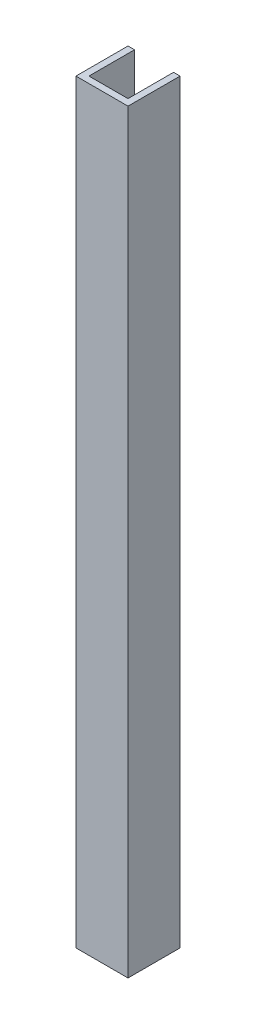
ISO-10303-21;
HEADER;
FILE_DESCRIPTION(('STEP AP214'),'2;1');
FILE_NAME('part.step','',(''),(''),'','','');
FILE_SCHEMA(('AUTOMOTIVE_DESIGN { 1 0 10303 214 1 1 1 1 }'));
ENDSEC;
DATA;
#1=APPLICATION_CONTEXT('core data for automotive mechanical design processes');
#2=APPLICATION_PROTOCOL_DEFINITION('international standard','automotive_design',2000,#1);
#3=PRODUCT_CONTEXT('',#1,'mechanical');
#4=PRODUCT('Part','Part','',(#3));
#5=PRODUCT_RELATED_PRODUCT_CATEGORY('part','',(#4));
#6=PRODUCT_DEFINITION_FORMATION('','',#4);
#7=PRODUCT_DEFINITION_CONTEXT('part definition',#1,'design');
#8=PRODUCT_DEFINITION('design','',#6,#7);
#9=PRODUCT_DEFINITION_SHAPE('','',#8);
#10=(LENGTH_UNIT() NAMED_UNIT(*) SI_UNIT(.MILLI.,.METRE.));
#11=(NAMED_UNIT(*) PLANE_ANGLE_UNIT() SI_UNIT($,.RADIAN.));
#12=(NAMED_UNIT(*) SI_UNIT($,.STERADIAN.) SOLID_ANGLE_UNIT());
#13=UNCERTAINTY_MEASURE_WITH_UNIT(LENGTH_MEASURE(1.E-05),#10,'distance_accuracy_value','');
#14=(GEOMETRIC_REPRESENTATION_CONTEXT(3) GLOBAL_UNCERTAINTY_ASSIGNED_CONTEXT((#13)) GLOBAL_UNIT_ASSIGNED_CONTEXT((#10,
#11,#12)) REPRESENTATION_CONTEXT('',''));
#15=CARTESIAN_POINT('',(0.,0.,0.));
#16=DIRECTION('',(0.,0.,1.));
#17=DIRECTION('',(1.,0.,0.));
#18=AXIS2_PLACEMENT_3D('',#15,#16,#17);
#19=CARTESIAN_POINT('',(25.4,368.3,0.));
#20=DIRECTION('',(-1.,0.,0.));
#21=DIRECTION('',(0.,0.,1.));
#22=AXIS2_PLACEMENT_3D('',#19,#20,#21);
#23=PLANE('',#22);
#24=DIRECTION('',(0.,0.,-1.));
#25=VECTOR('',#24,1.);
#26=CARTESIAN_POINT('',(25.4,0.,0.));
#27=LINE('',#26,#25);
#28=CARTESIAN_POINT('',(25.4,0.,0.));
#29=VERTEX_POINT('',#28);
#30=CARTESIAN_POINT('',(25.4,0.,-25.4));
#31=VERTEX_POINT('',#30);
#32=EDGE_CURVE('E130',#29,#31,#27,.T.);
#33=ORIENTED_EDGE('',*,*,#32,.T.);
#34=DIRECTION('',(0.,-1.,0.));
#35=VECTOR('',#34,1.);
#36=CARTESIAN_POINT('',(25.4,368.3,-25.4));
#37=LINE('',#36,#35);
#38=CARTESIAN_POINT('',(25.4,368.3,-25.4));
#39=VERTEX_POINT('',#38);
#40=EDGE_CURVE('E11',#39,#31,#37,.T.);
#41=ORIENTED_EDGE('',*,*,#40,.F.);
#42=DIRECTION('',(0.,0.,-1.));
#43=VECTOR('',#42,1.);
#44=CARTESIAN_POINT('',(25.4,368.3,0.));
#45=LINE('',#44,#43);
#46=CARTESIAN_POINT('',(25.4,368.3,0.));
#47=VERTEX_POINT('',#46);
#48=EDGE_CURVE('E88',#47,#39,#45,.T.);
#49=ORIENTED_EDGE('',*,*,#48,.F.);
#50=DIRECTION('',(0.,-1.,0.));
#51=VECTOR('',#50,1.);
#52=CARTESIAN_POINT('',(25.4,368.3,0.));
#53=LINE('',#52,#51);
#54=EDGE_CURVE('E129',#47,#29,#53,.T.);
#55=ORIENTED_EDGE('',*,*,#54,.T.);
#56=EDGE_LOOP('',(#33,#41,#49,#55));
#57=FACE_BOUND('',#56,.T.);
#58=ADVANCED_FACE('F33',(#57),#23,.F.);
#59=CARTESIAN_POINT('',(22.225,368.3,-25.4));
#60=DIRECTION('',(0.,0.,-1.));
#61=DIRECTION('',(-1.,0.,0.));
#62=AXIS2_PLACEMENT_3D('',#59,#60,#61);
#63=PLANE('',#62);
#64=DIRECTION('',(1.,0.,0.));
#65=VECTOR('',#64,1.);
#66=CARTESIAN_POINT('',(22.225,0.,-25.4));
#67=LINE('',#66,#65);
#68=CARTESIAN_POINT('',(22.225,0.,-25.4));
#69=VERTEX_POINT('',#68);
#70=EDGE_CURVE('E133',#69,#31,#67,.T.);
#71=ORIENTED_EDGE('',*,*,#70,.F.);
#72=DIRECTION('',(0.,-1.,0.));
#73=VECTOR('',#72,1.);
#74=CARTESIAN_POINT('',(22.225,368.3,-25.4));
#75=LINE('',#74,#73);
#76=CARTESIAN_POINT('',(22.225,368.3,-25.4));
#77=VERTEX_POINT('',#76);
#78=EDGE_CURVE('E41',#77,#69,#75,.T.);
#79=ORIENTED_EDGE('',*,*,#78,.F.);
#80=DIRECTION('',(1.,0.,0.));
#81=VECTOR('',#80,1.);
#82=CARTESIAN_POINT('',(22.225,368.3,-25.4));
#83=LINE('',#82,#81);
#84=EDGE_CURVE('E172',#77,#39,#83,.T.);
#85=ORIENTED_EDGE('',*,*,#84,.T.);
#86=ORIENTED_EDGE('',*,*,#40,.T.);
#87=EDGE_LOOP('',(#71,#79,#85,#86));
#88=FACE_BOUND('',#87,.T.);
#89=ADVANCED_FACE('F163',(#88),#63,.T.);
#90=CARTESIAN_POINT('',(22.225,368.3,0.));
#91=DIRECTION('',(-1.,0.,0.));
#92=DIRECTION('',(0.,0.,1.));
#93=AXIS2_PLACEMENT_3D('',#90,#91,#92);
#94=PLANE('',#93);
#95=DIRECTION('',(0.,0.,-1.));
#96=VECTOR('',#95,1.);
#97=CARTESIAN_POINT('',(22.225,0.,0.));
#98=LINE('',#97,#96);
#99=CARTESIAN_POINT('',(22.225,0.,-3.175));
#100=VERTEX_POINT('',#99);
#101=EDGE_CURVE('E136',#100,#69,#98,.T.);
#102=ORIENTED_EDGE('',*,*,#101,.F.);
#103=DIRECTION('',(0.,-1.,0.));
#104=VECTOR('',#103,1.);
#105=CARTESIAN_POINT('',(22.225,368.3,-3.175));
#106=LINE('',#105,#104);
#107=CARTESIAN_POINT('',(22.225,368.3,-3.175));
#108=VERTEX_POINT('',#107);
#109=EDGE_CURVE('E153',#108,#100,#106,.T.);
#110=ORIENTED_EDGE('',*,*,#109,.F.);
#111=DIRECTION('',(0.,0.,-1.));
#112=VECTOR('',#111,1.);
#113=CARTESIAN_POINT('',(22.225,368.3,0.));
#114=LINE('',#113,#112);
#115=EDGE_CURVE('E160',#108,#77,#114,.T.);
#116=ORIENTED_EDGE('',*,*,#115,.T.);
#117=ORIENTED_EDGE('',*,*,#78,.T.);
#118=EDGE_LOOP('',(#102,#110,#116,#117));
#119=FACE_BOUND('',#118,.T.);
#120=ADVANCED_FACE('F158',(#119),#94,.T.);
#121=CARTESIAN_POINT('',(0.,368.3,-3.175));
#122=DIRECTION('',(0.,0.,-1.));
#123=DIRECTION('',(-1.,0.,0.));
#124=AXIS2_PLACEMENT_3D('',#121,#122,#123);
#125=PLANE('',#124);
#126=DIRECTION('',(1.,0.,0.));
#127=VECTOR('',#126,1.);
#128=CARTESIAN_POINT('',(0.,0.,-3.175));
#129=LINE('',#128,#127);
#130=CARTESIAN_POINT('',(3.175,0.,-3.175));
#131=VERTEX_POINT('',#130);
#132=EDGE_CURVE('E139',#131,#100,#129,.T.);
#133=ORIENTED_EDGE('',*,*,#132,.F.);
#134=DIRECTION('',(0.,-1.,0.));
#135=VECTOR('',#134,1.);
#136=CARTESIAN_POINT('',(3.175,368.3,-3.175));
#137=LINE('',#136,#135);
#138=CARTESIAN_POINT('',(3.175,368.3,-3.175));
#139=VERTEX_POINT('',#138);
#140=EDGE_CURVE('E151',#139,#131,#137,.T.);
#141=ORIENTED_EDGE('',*,*,#140,.F.);
#142=DIRECTION('',(1.,0.,0.));
#143=VECTOR('',#142,1.);
#144=CARTESIAN_POINT('',(0.,368.3,-3.175));
#145=LINE('',#144,#143);
#146=EDGE_CURVE('E124',#139,#108,#145,.T.);
#147=ORIENTED_EDGE('',*,*,#146,.T.);
#148=ORIENTED_EDGE('',*,*,#109,.T.);
#149=EDGE_LOOP('',(#133,#141,#147,#148));
#150=FACE_BOUND('',#149,.T.);
#151=ADVANCED_FACE('F170',(#150),#125,.T.);
#152=CARTESIAN_POINT('',(3.175,368.3,-25.4));
#153=DIRECTION('',(1.,0.,0.));
#154=DIRECTION('',(0.,0.,-1.));
#155=AXIS2_PLACEMENT_3D('',#152,#153,#154);
#156=PLANE('',#155);
#157=DIRECTION('',(0.,0.,-1.));
#158=VECTOR('',#157,1.);
#159=CARTESIAN_POINT('',(3.175,0.,-25.4));
#160=LINE('',#159,#158);
#161=CARTESIAN_POINT('',(3.175,0.,-25.4));
#162=VERTEX_POINT('',#161);
#163=EDGE_CURVE('E142',#162,#131,#160,.F.);
#164=ORIENTED_EDGE('',*,*,#163,.F.);
#165=DIRECTION('',(0.,-1.,0.));
#166=VECTOR('',#165,1.);
#167=CARTESIAN_POINT('',(3.175,368.3,-25.4));
#168=LINE('',#167,#166);
#169=CARTESIAN_POINT('',(3.175,368.3,-25.4));
#170=VERTEX_POINT('',#169);
#171=EDGE_CURVE('E112',#170,#162,#168,.T.);
#172=ORIENTED_EDGE('',*,*,#171,.F.);
#173=DIRECTION('',(0.,0.,-1.));
#174=VECTOR('',#173,1.);
#175=CARTESIAN_POINT('',(3.175,368.3,-25.4));
#176=LINE('',#175,#174);
#177=EDGE_CURVE('E122',#170,#139,#176,.F.);
#178=ORIENTED_EDGE('',*,*,#177,.T.);
#179=ORIENTED_EDGE('',*,*,#140,.T.);
#180=EDGE_LOOP('',(#164,#172,#178,#179));
#181=FACE_BOUND('',#180,.T.);
#182=ADVANCED_FACE('F177',(#181),#156,.T.);
#183=CARTESIAN_POINT('',(0.,368.3,-25.4));
#184=DIRECTION('',(0.,0.,-1.));
#185=DIRECTION('',(-1.,0.,0.));
#186=AXIS2_PLACEMENT_3D('',#183,#184,#185);
#187=PLANE('',#186);
#188=DIRECTION('',(1.,0.,0.));
#189=VECTOR('',#188,1.);
#190=CARTESIAN_POINT('',(0.,0.,-25.4));
#191=LINE('',#190,#189);
#192=CARTESIAN_POINT('',(0.,0.,-25.4));
#193=VERTEX_POINT('',#192);
#194=EDGE_CURVE('E111',#193,#162,#191,.T.);
#195=ORIENTED_EDGE('',*,*,#194,.F.);
#196=DIRECTION('',(0.,-1.,0.));
#197=VECTOR('',#196,1.);
#198=CARTESIAN_POINT('',(0.,368.3,-25.4));
#199=LINE('',#198,#197);
#200=CARTESIAN_POINT('',(0.,368.3,-25.4));
#201=VERTEX_POINT('',#200);
#202=EDGE_CURVE('E105',#201,#193,#199,.T.);
#203=ORIENTED_EDGE('',*,*,#202,.F.);
#204=DIRECTION('',(1.,0.,0.));
#205=VECTOR('',#204,1.);
#206=CARTESIAN_POINT('',(0.,368.3,-25.4));
#207=LINE('',#206,#205);
#208=EDGE_CURVE('E109',#201,#170,#207,.T.);
#209=ORIENTED_EDGE('',*,*,#208,.T.);
#210=ORIENTED_EDGE('',*,*,#171,.T.);
#211=EDGE_LOOP('',(#195,#203,#209,#210));
#212=FACE_BOUND('',#211,.T.);
#213=ADVANCED_FACE('F107',(#212),#187,.T.);
#214=CARTESIAN_POINT('',(0.,368.3,-25.4));
#215=DIRECTION('',(1.,0.,0.));
#216=DIRECTION('',(0.,0.,-1.));
#217=AXIS2_PLACEMENT_3D('',#214,#215,#216);
#218=PLANE('',#217);
#219=DIRECTION('',(0.,0.,1.));
#220=VECTOR('',#219,1.);
#221=CARTESIAN_POINT('',(0.,0.,-25.4));
#222=LINE('',#221,#220);
#223=CARTESIAN_POINT('',(0.,0.,0.));
#224=VERTEX_POINT('',#223);
#225=EDGE_CURVE('E76',#193,#224,#222,.T.);
#226=ORIENTED_EDGE('',*,*,#225,.T.);
#227=DIRECTION('',(0.,-1.,0.));
#228=VECTOR('',#227,1.);
#229=CARTESIAN_POINT('',(0.,368.3,0.));
#230=LINE('',#229,#228);
#231=CARTESIAN_POINT('',(0.,368.3,0.));
#232=VERTEX_POINT('',#231);
#233=EDGE_CURVE('E113',#232,#224,#230,.T.);
#234=ORIENTED_EDGE('',*,*,#233,.F.);
#235=DIRECTION('',(0.,0.,1.));
#236=VECTOR('',#235,1.);
#237=CARTESIAN_POINT('',(0.,368.3,-25.4));
#238=LINE('',#237,#236);
#239=EDGE_CURVE('E115',#201,#232,#238,.T.);
#240=ORIENTED_EDGE('',*,*,#239,.F.);
#241=ORIENTED_EDGE('',*,*,#202,.T.);
#242=EDGE_LOOP('',(#226,#234,#240,#241));
#243=FACE_BOUND('',#242,.T.);
#244=ADVANCED_FACE('F116',(#243),#218,.F.);
#245=CARTESIAN_POINT('',(0.,368.3,0.));
#246=DIRECTION('',(0.,0.,-1.));
#247=DIRECTION('',(-1.,0.,0.));
#248=AXIS2_PLACEMENT_3D('',#245,#246,#247);
#249=PLANE('',#248);
#250=DIRECTION('',(1.,0.,0.));
#251=VECTOR('',#250,1.);
#252=CARTESIAN_POINT('',(0.,0.,0.));
#253=LINE('',#252,#251);
#254=EDGE_CURVE('E82',#224,#29,#253,.T.);
#255=ORIENTED_EDGE('',*,*,#254,.T.);
#256=ORIENTED_EDGE('',*,*,#54,.F.);
#257=DIRECTION('',(1.,0.,0.));
#258=VECTOR('',#257,1.);
#259=CARTESIAN_POINT('',(0.,368.3,0.));
#260=LINE('',#259,#258);
#261=EDGE_CURVE('E49',#232,#47,#260,.T.);
#262=ORIENTED_EDGE('',*,*,#261,.F.);
#263=ORIENTED_EDGE('',*,*,#233,.T.);
#264=EDGE_LOOP('',(#255,#256,#262,#263));
#265=FACE_BOUND('',#264,.T.);
#266=ADVANCED_FACE('F179',(#265),#249,.F.);
#267=CARTESIAN_POINT('',(0.,368.3,0.));
#268=DIRECTION('',(0.,-1.,0.));
#269=DIRECTION('',(-1.,0.,0.));
#270=AXIS2_PLACEMENT_3D('',#267,#268,#269);
#271=PLANE('',#270);
#272=ORIENTED_EDGE('',*,*,#48,.T.);
#273=ORIENTED_EDGE('',*,*,#84,.F.);
#274=ORIENTED_EDGE('',*,*,#115,.F.);
#275=ORIENTED_EDGE('',*,*,#146,.F.);
#276=ORIENTED_EDGE('',*,*,#177,.F.);
#277=ORIENTED_EDGE('',*,*,#208,.F.);
#278=ORIENTED_EDGE('',*,*,#239,.T.);
#279=ORIENTED_EDGE('',*,*,#261,.T.);
#280=EDGE_LOOP('',(#272,#273,#274,#275,#276,#277,#278,#279));
#281=FACE_BOUND('',#280,.T.);
#282=ADVANCED_FACE('F119',(#281),#271,.F.);
#283=CARTESIAN_POINT('',(0.,0.,0.));
#284=DIRECTION('',(0.,-1.,0.));
#285=DIRECTION('',(-1.,0.,0.));
#286=AXIS2_PLACEMENT_3D('',#283,#284,#285);
#287=PLANE('',#286);
#288=ORIENTED_EDGE('',*,*,#32,.F.);
#289=ORIENTED_EDGE('',*,*,#254,.F.);
#290=ORIENTED_EDGE('',*,*,#225,.F.);
#291=ORIENTED_EDGE('',*,*,#194,.T.);
#292=ORIENTED_EDGE('',*,*,#163,.T.);
#293=ORIENTED_EDGE('',*,*,#132,.T.);
#294=ORIENTED_EDGE('',*,*,#101,.T.);
#295=ORIENTED_EDGE('',*,*,#70,.T.);
#296=EDGE_LOOP('',(#288,#289,#290,#291,#292,#293,#294,#295));
#297=FACE_BOUND('',#296,.T.);
#298=ADVANCED_FACE('F166',(#297),#287,.T.);
#299=CLOSED_SHELL('',(#58,#89,#120,#151,#182,#213,#244,#266,#282,#298));
#300=MANIFOLD_SOLID_BREP('B2',#299);
#301=ADVANCED_BREP_SHAPE_REPRESENTATION('',(#18,#300),#14);
#302=SHAPE_DEFINITION_REPRESENTATION(#9,#301);
ENDSEC;
END-ISO-10303-21;
